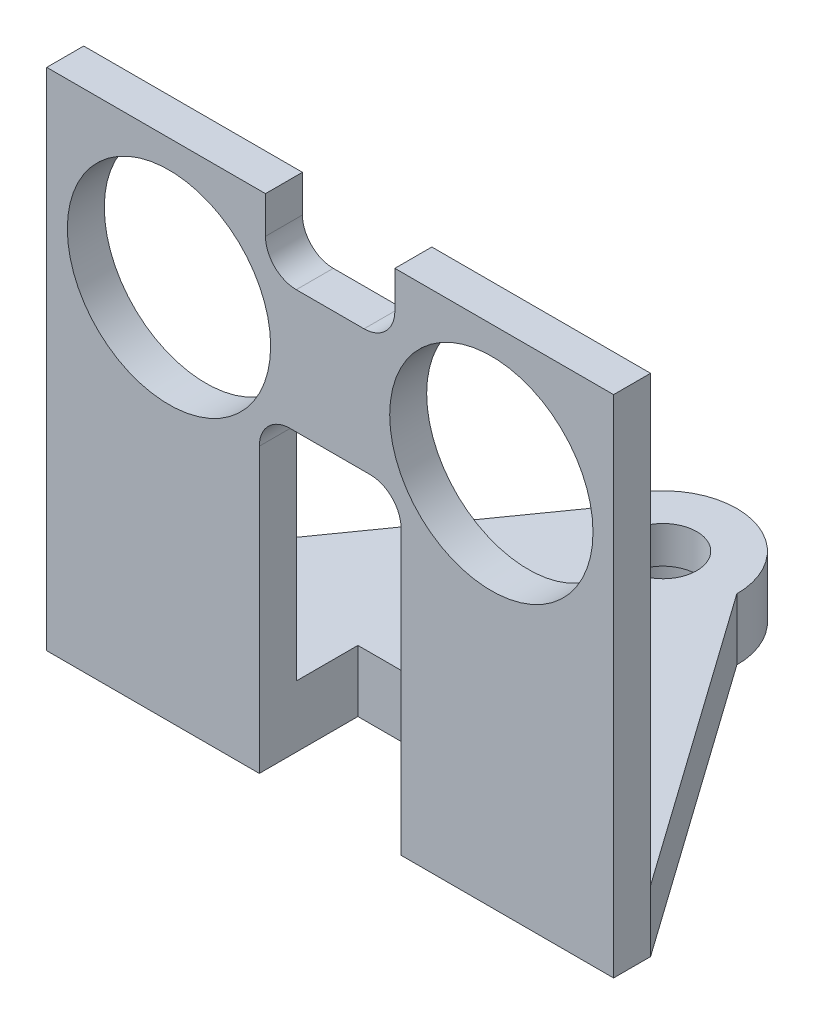
ISO-10303-21;
HEADER;
FILE_DESCRIPTION(('STEP AP214'),'2;1');
FILE_NAME('part.step','',(''),(''),'','','');
FILE_SCHEMA(('AUTOMOTIVE_DESIGN { 1 0 10303 214 1 1 1 1 }'));
ENDSEC;
DATA;
#1=APPLICATION_CONTEXT('core data for automotive mechanical design processes');
#2=APPLICATION_PROTOCOL_DEFINITION('international standard','automotive_design',2000,#1);
#3=PRODUCT_CONTEXT('',#1,'mechanical');
#4=PRODUCT('Part','Part','',(#3));
#5=PRODUCT_RELATED_PRODUCT_CATEGORY('part','',(#4));
#6=PRODUCT_DEFINITION_FORMATION('','',#4);
#7=PRODUCT_DEFINITION_CONTEXT('part definition',#1,'design');
#8=PRODUCT_DEFINITION('design','',#6,#7);
#9=PRODUCT_DEFINITION_SHAPE('','',#8);
#10=(LENGTH_UNIT() NAMED_UNIT(*) SI_UNIT(.MILLI.,.METRE.));
#11=(NAMED_UNIT(*) PLANE_ANGLE_UNIT() SI_UNIT($,.RADIAN.));
#12=(NAMED_UNIT(*) SI_UNIT($,.STERADIAN.) SOLID_ANGLE_UNIT());
#13=UNCERTAINTY_MEASURE_WITH_UNIT(LENGTH_MEASURE(1.E-05),#10,'distance_accuracy_value','');
#14=(GEOMETRIC_REPRESENTATION_CONTEXT(3) GLOBAL_UNCERTAINTY_ASSIGNED_CONTEXT((#13)) GLOBAL_UNIT_ASSIGNED_CONTEXT((#10,
#11,#12)) REPRESENTATION_CONTEXT('',''));
#15=CARTESIAN_POINT('',(0.,0.,0.));
#16=DIRECTION('',(0.,0.,1.));
#17=DIRECTION('',(1.,0.,0.));
#18=AXIS2_PLACEMENT_3D('',#15,#16,#17);
#19=CARTESIAN_POINT('',(0.,-25.5,-7.6));
#20=DIRECTION('',(0.,1.,0.));
#21=DIRECTION('',(0.,0.,1.));
#22=AXIS2_PLACEMENT_3D('',#19,#20,#21);
#23=CYLINDRICAL_SURFACE('',#22,2.1);
#24=DIRECTION('',(0.,1.,0.));
#25=VECTOR('',#24,1.);
#26=CARTESIAN_POINT('',(-2.1,-25.5,-7.6));
#27=LINE('',#26,#25);
#28=CARTESIAN_POINT('',(-2.1,-25.5,-7.6));
#29=VERTEX_POINT('',#28);
#30=CARTESIAN_POINT('',(-2.1,-23.5,-7.6));
#31=VERTEX_POINT('',#30);
#32=EDGE_CURVE('E332',#29,#31,#27,.T.);
#33=ORIENTED_EDGE('',*,*,#32,.T.);
#34=CARTESIAN_POINT('',(0.,-23.5,-7.6));
#35=DIRECTION('',(0.,1.,0.));
#36=DIRECTION('',(0.,0.,1.));
#37=AXIS2_PLACEMENT_3D('',#34,#35,#36);
#38=CIRCLE('',#37,2.1);
#39=CARTESIAN_POINT('',(2.1,-23.5,-7.6));
#40=VERTEX_POINT('',#39);
#41=EDGE_CURVE('E54',#31,#40,#38,.T.);
#42=ORIENTED_EDGE('',*,*,#41,.T.);
#43=DIRECTION('',(0.,1.,0.));
#44=VECTOR('',#43,1.);
#45=CARTESIAN_POINT('',(2.1,-25.5,-7.6));
#46=LINE('',#45,#44);
#47=CARTESIAN_POINT('',(2.1,-25.5,-7.6));
#48=VERTEX_POINT('',#47);
#49=EDGE_CURVE('E357',#48,#40,#46,.T.);
#50=ORIENTED_EDGE('',*,*,#49,.F.);
#51=CARTESIAN_POINT('',(0.,-25.5,-7.6));
#52=DIRECTION('',(0.,-1.,0.));
#53=DIRECTION('',(0.,0.,-1.));
#54=AXIS2_PLACEMENT_3D('',#51,#52,#53);
#55=CIRCLE('',#54,2.1);
#56=EDGE_CURVE('E352',#48,#29,#55,.T.);
#57=ORIENTED_EDGE('',*,*,#56,.T.);
#58=EDGE_LOOP('',(#33,#42,#50,#57));
#59=FACE_BOUND('',#58,.T.);
#60=ADVANCED_FACE('F39',(#59),#23,.F.);
#61=CARTESIAN_POINT('',(1.44072050789901,-25.5,0.122988336040159));
#62=DIRECTION('',(0.996376129781137,0.,0.0850564988837555));
#63=DIRECTION('',(0.0850564988837555,0.,-0.996376129781137));
#64=AXIS2_PLACEMENT_3D('',#61,#62,#63);
#65=PLANE('',#64);
#66=DIRECTION('',(0.0850564988837556,0.,-0.996376129781137));
#67=VECTOR('',#66,1.);
#68=CARTESIAN_POINT('',(2.1,-23.5,-7.6));
#69=LINE('',#68,#67);
#70=CARTESIAN_POINT('',(3.44935774398346,-23.5,-23.4067621438063));
#71=VERTEX_POINT('',#70);
#72=EDGE_CURVE('E836',#40,#71,#69,.T.);
#73=ORIENTED_EDGE('',*,*,#72,.T.);
#74=DIRECTION('',(0.,1.,0.));
#75=VECTOR('',#74,1.);
#76=CARTESIAN_POINT('',(3.44935774398346,-25.5,-23.4067621438063));
#77=LINE('',#76,#75);
#78=CARTESIAN_POINT('',(3.44935774398346,-25.5,-23.4067621438063));
#79=VERTEX_POINT('',#78);
#80=EDGE_CURVE('E375',#79,#71,#77,.T.);
#81=ORIENTED_EDGE('',*,*,#80,.F.);
#82=DIRECTION('',(0.0850564988837555,0.,-0.996376129781137));
#83=VECTOR('',#82,1.);
#84=CARTESIAN_POINT('',(1.44072050789901,-25.5,0.122988336040159));
#85=LINE('',#84,#83);
#86=EDGE_CURVE('E767',#48,#79,#85,.T.);
#87=ORIENTED_EDGE('',*,*,#86,.F.);
#88=ORIENTED_EDGE('',*,*,#49,.T.);
#89=EDGE_LOOP('',(#73,#81,#87,#88));
#90=FACE_BOUND('',#89,.T.);
#91=ADVANCED_FACE('F396',(#90),#65,.F.);
#92=CARTESIAN_POINT('',(0.,-25.5,-24.));
#93=DIRECTION('',(0.,1.,0.));
#94=DIRECTION('',(0.,0.,1.));
#95=AXIS2_PLACEMENT_3D('',#92,#93,#94);
#96=CYLINDRICAL_SURFACE('',#95,3.5);
#97=ORIENTED_EDGE('',*,*,#80,.T.);
#98=CARTESIAN_POINT('',(0.,-23.5,-24.));
#99=DIRECTION('',(0.,1.,0.));
#100=DIRECTION('',(0.,0.,1.));
#101=AXIS2_PLACEMENT_3D('',#98,#99,#100);
#102=CIRCLE('',#101,3.5);
#103=CARTESIAN_POINT('',(-3.44935774398346,-23.5,-23.4067621438063));
#104=VERTEX_POINT('',#103);
#105=EDGE_CURVE('E761',#71,#104,#102,.T.);
#106=ORIENTED_EDGE('',*,*,#105,.T.);
#107=DIRECTION('',(0.,1.,0.));
#108=VECTOR('',#107,1.);
#109=CARTESIAN_POINT('',(-3.44935774398346,-25.5,-23.4067621438063));
#110=LINE('',#109,#108);
#111=CARTESIAN_POINT('',(-3.44935774398346,-25.5,-23.4067621438063));
#112=VERTEX_POINT('',#111);
#113=EDGE_CURVE('E372',#112,#104,#110,.T.);
#114=ORIENTED_EDGE('',*,*,#113,.F.);
#115=CARTESIAN_POINT('',(0.,-25.5,-24.));
#116=DIRECTION('',(0.,-1.,0.));
#117=DIRECTION('',(0.,0.,-1.));
#118=AXIS2_PLACEMENT_3D('',#115,#116,#117);
#119=CIRCLE('',#118,3.5);
#120=EDGE_CURVE('E759',#112,#79,#119,.T.);
#121=ORIENTED_EDGE('',*,*,#120,.T.);
#122=EDGE_LOOP('',(#97,#106,#114,#121));
#123=FACE_BOUND('',#122,.T.);
#124=ADVANCED_FACE('F402',(#123),#96,.F.);
#125=CARTESIAN_POINT('',(-1.44072050789901,-25.5,0.122988336040159));
#126=DIRECTION('',(0.996376129781137,0.,-0.0850564988837556));
#127=DIRECTION('',(-0.0850564988837556,0.,-0.996376129781137));
#128=AXIS2_PLACEMENT_3D('',#125,#126,#127);
#129=PLANE('',#128);
#130=ORIENTED_EDGE('',*,*,#113,.T.);
#131=DIRECTION('',(0.0850564988837557,0.,0.996376129781137));
#132=VECTOR('',#131,1.);
#133=CARTESIAN_POINT('',(-2.1,-23.5,-7.6));
#134=LINE('',#133,#132);
#135=EDGE_CURVE('E337',#104,#31,#134,.T.);
#136=ORIENTED_EDGE('',*,*,#135,.T.);
#137=ORIENTED_EDGE('',*,*,#32,.F.);
#138=DIRECTION('',(-0.0850564988837557,0.,-0.996376129781137));
#139=VECTOR('',#138,1.);
#140=CARTESIAN_POINT('',(-1.44072050789901,-25.5,0.122988336040159));
#141=LINE('',#140,#139);
#142=EDGE_CURVE('E751',#29,#112,#141,.T.);
#143=ORIENTED_EDGE('',*,*,#142,.T.);
#144=EDGE_LOOP('',(#130,#136,#137,#143));
#145=FACE_BOUND('',#144,.T.);
#146=ADVANCED_FACE('F394',(#145),#129,.T.);
#147=CARTESIAN_POINT('',(0.,10.,3.));
#148=DIRECTION('',(0.,-1.,0.));
#149=DIRECTION('',(0.,0.,-1.));
#150=AXIS2_PLACEMENT_3D('',#147,#148,#149);
#151=PLANE('',#150);
#152=DIRECTION('',(-1.,0.,0.));
#153=VECTOR('',#152,1.);
#154=CARTESIAN_POINT('',(0.,10.,0.));
#155=LINE('',#154,#153);
#156=CARTESIAN_POINT('',(2.74999999999998,10.,0.));
#157=VERTEX_POINT('',#156);
#158=CARTESIAN_POINT('',(-2.74999999999998,10.,0.));
#159=VERTEX_POINT('',#158);
#160=EDGE_CURVE('E186',#157,#159,#155,.T.);
#161=ORIENTED_EDGE('',*,*,#160,.T.);
#162=DIRECTION('',(0.,0.,-1.));
#163=VECTOR('',#162,1.);
#164=CARTESIAN_POINT('',(-2.74999999999998,10.,3.));
#165=LINE('',#164,#163);
#166=CARTESIAN_POINT('',(-2.74999999999998,10.,3.));
#167=VERTEX_POINT('',#166);
#168=EDGE_CURVE('E11',#167,#159,#165,.T.);
#169=ORIENTED_EDGE('',*,*,#168,.F.);
#170=DIRECTION('',(-1.,0.,0.));
#171=VECTOR('',#170,1.);
#172=CARTESIAN_POINT('',(0.,10.,3.));
#173=LINE('',#172,#171);
#174=CARTESIAN_POINT('',(2.74999999999998,10.,3.));
#175=VERTEX_POINT('',#174);
#176=EDGE_CURVE('E382',#175,#167,#173,.T.);
#177=ORIENTED_EDGE('',*,*,#176,.F.);
#178=DIRECTION('',(0.,0.,-1.));
#179=VECTOR('',#178,1.);
#180=CARTESIAN_POINT('',(2.74999999999998,10.,3.));
#181=LINE('',#180,#179);
#182=EDGE_CURVE('E63',#175,#157,#181,.T.);
#183=ORIENTED_EDGE('',*,*,#182,.T.);
#184=EDGE_LOOP('',(#161,#169,#177,#183));
#185=FACE_BOUND('',#184,.T.);
#186=ADVANCED_FACE('F385',(#185),#151,.F.);
#187=CARTESIAN_POINT('',(-2.75,12.5,3.));
#188=DIRECTION('',(0.,0.,-1.));
#189=DIRECTION('',(-1.,0.,0.));
#190=AXIS2_PLACEMENT_3D('',#187,#188,#189);
#191=CYLINDRICAL_SURFACE('',#190,2.5);
#192=CARTESIAN_POINT('',(-2.75,12.5,0.));
#193=DIRECTION('',(0.,0.,1.));
#194=DIRECTION('',(1.,0.,0.));
#195=AXIS2_PLACEMENT_3D('',#192,#193,#194);
#196=CIRCLE('',#195,2.5);
#197=CARTESIAN_POINT('',(-5.25,12.5,0.));
#198=VERTEX_POINT('',#197);
#199=EDGE_CURVE('E189',#159,#198,#196,.F.);
#200=ORIENTED_EDGE('',*,*,#199,.T.);
#201=DIRECTION('',(0.,0.,-1.));
#202=VECTOR('',#201,1.);
#203=CARTESIAN_POINT('',(-5.25,12.5,3.));
#204=LINE('',#203,#202);
#205=CARTESIAN_POINT('',(-5.25,12.5,3.));
#206=VERTEX_POINT('',#205);
#207=EDGE_CURVE('E47',#206,#198,#204,.T.);
#208=ORIENTED_EDGE('',*,*,#207,.F.);
#209=CARTESIAN_POINT('',(-2.75,12.5,3.));
#210=DIRECTION('',(0.,0.,1.));
#211=DIRECTION('',(1.,0.,0.));
#212=AXIS2_PLACEMENT_3D('',#209,#210,#211);
#213=CIRCLE('',#212,2.5);
#214=EDGE_CURVE('E120',#167,#206,#213,.F.);
#215=ORIENTED_EDGE('',*,*,#214,.F.);
#216=ORIENTED_EDGE('',*,*,#168,.T.);
#217=EDGE_LOOP('',(#200,#208,#215,#216));
#218=FACE_BOUND('',#217,.T.);
#219=ADVANCED_FACE('F386',(#218),#191,.F.);
#220=CARTESIAN_POINT('',(-5.25,0.,3.));
#221=DIRECTION('',(-1.,0.,0.));
#222=DIRECTION('',(0.,0.,1.));
#223=AXIS2_PLACEMENT_3D('',#220,#221,#222);
#224=PLANE('',#223);
#225=DIRECTION('',(0.,1.,0.));
#226=VECTOR('',#225,1.);
#227=CARTESIAN_POINT('',(-5.25,0.,0.));
#228=LINE('',#227,#226);
#229=CARTESIAN_POINT('',(-5.25,15.5,0.));
#230=VERTEX_POINT('',#229);
#231=EDGE_CURVE('E191',#198,#230,#228,.T.);
#232=ORIENTED_EDGE('',*,*,#231,.T.);
#233=DIRECTION('',(0.,0.,-1.));
#234=VECTOR('',#233,1.);
#235=CARTESIAN_POINT('',(-5.25,15.5,3.));
#236=LINE('',#235,#234);
#237=CARTESIAN_POINT('',(-5.25,15.5,3.));
#238=VERTEX_POINT('',#237);
#239=EDGE_CURVE('E245',#238,#230,#236,.T.);
#240=ORIENTED_EDGE('',*,*,#239,.F.);
#241=DIRECTION('',(0.,1.,0.));
#242=VECTOR('',#241,1.);
#243=CARTESIAN_POINT('',(-5.25,0.,3.));
#244=LINE('',#243,#242);
#245=EDGE_CURVE('E253',#206,#238,#244,.T.);
#246=ORIENTED_EDGE('',*,*,#245,.F.);
#247=ORIENTED_EDGE('',*,*,#207,.T.);
#248=EDGE_LOOP('',(#232,#240,#246,#247));
#249=FACE_BOUND('',#248,.T.);
#250=ADVANCED_FACE('F251',(#249),#224,.F.);
#251=CARTESIAN_POINT('',(0.,15.5,3.));
#252=DIRECTION('',(0.,-1.,0.));
#253=DIRECTION('',(1.,0.,0.));
#254=AXIS2_PLACEMENT_3D('',#251,#252,#253);
#255=PLANE('',#254);
#256=DIRECTION('',(-1.,0.,0.));
#257=VECTOR('',#256,1.);
#258=CARTESIAN_POINT('',(0.,15.5,0.));
#259=LINE('',#258,#257);
#260=CARTESIAN_POINT('',(-23.,15.5,0.));
#261=VERTEX_POINT('',#260);
#262=EDGE_CURVE('E193',#230,#261,#259,.T.);
#263=ORIENTED_EDGE('',*,*,#262,.T.);
#264=DIRECTION('',(0.,0.,-1.));
#265=VECTOR('',#264,1.);
#266=CARTESIAN_POINT('',(-23.,15.5,3.));
#267=LINE('',#266,#265);
#268=CARTESIAN_POINT('',(-23.,15.5,3.));
#269=VERTEX_POINT('',#268);
#270=EDGE_CURVE('E242',#269,#261,#267,.T.);
#271=ORIENTED_EDGE('',*,*,#270,.F.);
#272=DIRECTION('',(-1.,0.,0.));
#273=VECTOR('',#272,1.);
#274=CARTESIAN_POINT('',(0.,15.5,3.));
#275=LINE('',#274,#273);
#276=EDGE_CURVE('E277',#238,#269,#275,.T.);
#277=ORIENTED_EDGE('',*,*,#276,.F.);
#278=ORIENTED_EDGE('',*,*,#239,.T.);
#279=EDGE_LOOP('',(#263,#271,#277,#278));
#280=FACE_BOUND('',#279,.T.);
#281=ADVANCED_FACE('F262',(#280),#255,.F.);
#282=CARTESIAN_POINT('',(-23.,0.,3.));
#283=DIRECTION('',(1.,0.,0.));
#284=DIRECTION('',(0.,0.,-1.));
#285=AXIS2_PLACEMENT_3D('',#282,#283,#284);
#286=PLANE('',#285);
#287=DIRECTION('',(0.,-1.,0.));
#288=VECTOR('',#287,1.);
#289=CARTESIAN_POINT('',(-23.,0.,0.));
#290=LINE('',#289,#288);
#291=CARTESIAN_POINT('',(-23.,-20.5,0.));
#292=VERTEX_POINT('',#291);
#293=EDGE_CURVE('E195',#261,#292,#290,.T.);
#294=ORIENTED_EDGE('',*,*,#293,.T.);
#295=DIRECTION('',(0.,1.,0.));
#296=VECTOR('',#295,1.);
#297=CARTESIAN_POINT('',(-23.,-25.5,0.));
#298=LINE('',#297,#296);
#299=CARTESIAN_POINT('',(-23.,-25.5,0.));
#300=VERTEX_POINT('',#299);
#301=EDGE_CURVE('E353',#300,#292,#298,.T.);
#302=ORIENTED_EDGE('',*,*,#301,.F.);
#303=DIRECTION('',(0.,0.,1.));
#304=VECTOR('',#303,1.);
#305=CARTESIAN_POINT('',(-23.,-25.5,0.));
#306=LINE('',#305,#304);
#307=CARTESIAN_POINT('',(-23.,-25.5,3.));
#308=VERTEX_POINT('',#307);
#309=EDGE_CURVE('E273',#300,#308,#306,.T.);
#310=ORIENTED_EDGE('',*,*,#309,.T.);
#311=DIRECTION('',(0.,-1.,0.));
#312=VECTOR('',#311,1.);
#313=CARTESIAN_POINT('',(-23.,0.,3.));
#314=LINE('',#313,#312);
#315=EDGE_CURVE('E270',#269,#308,#314,.T.);
#316=ORIENTED_EDGE('',*,*,#315,.F.);
#317=ORIENTED_EDGE('',*,*,#270,.T.);
#318=EDGE_LOOP('',(#294,#302,#310,#316,#317));
#319=FACE_BOUND('',#318,.T.);
#320=ADVANCED_FACE('F266',(#319),#286,.F.);
#321=CARTESIAN_POINT('',(-5.74999999999999,0.,3.));
#322=DIRECTION('',(-1.,0.,0.));
#323=DIRECTION('',(0.,-1.,0.));
#324=AXIS2_PLACEMENT_3D('',#321,#322,#323);
#325=PLANE('',#324);
#326=DIRECTION('',(0.,1.,0.));
#327=VECTOR('',#326,1.);
#328=CARTESIAN_POINT('',(-5.74999999999999,0.,0.));
#329=LINE('',#328,#327);
#330=CARTESIAN_POINT('',(-5.74999999999999,-20.5,0.));
#331=VERTEX_POINT('',#330);
#332=CARTESIAN_POINT('',(-5.74999999999999,-2.50000000000002,0.));
#333=VERTEX_POINT('',#332);
#334=EDGE_CURVE('E200',#331,#333,#329,.T.);
#335=ORIENTED_EDGE('',*,*,#334,.T.);
#336=DIRECTION('',(0.,0.,-1.));
#337=VECTOR('',#336,1.);
#338=CARTESIAN_POINT('',(-5.74999999999999,-2.50000000000002,3.));
#339=LINE('',#338,#337);
#340=CARTESIAN_POINT('',(-5.74999999999999,-2.50000000000002,3.));
#341=VERTEX_POINT('',#340);
#342=EDGE_CURVE('E239',#341,#333,#339,.T.);
#343=ORIENTED_EDGE('',*,*,#342,.F.);
#344=DIRECTION('',(0.,1.,0.));
#345=VECTOR('',#344,1.);
#346=CARTESIAN_POINT('',(-5.74999999999999,0.,3.));
#347=LINE('',#346,#345);
#348=CARTESIAN_POINT('',(-5.74999999999999,-25.5,3.));
#349=VERTEX_POINT('',#348);
#350=EDGE_CURVE('E276',#349,#341,#347,.T.);
#351=ORIENTED_EDGE('',*,*,#350,.F.);
#352=DIRECTION('',(0.,0.,-1.));
#353=VECTOR('',#352,1.);
#354=CARTESIAN_POINT('',(-5.74999999999999,-25.5,0.));
#355=LINE('',#354,#353);
#356=CARTESIAN_POINT('',(-5.74999999999999,-25.5,-5.));
#357=VERTEX_POINT('',#356);
#358=EDGE_CURVE('E326',#349,#357,#355,.T.);
#359=ORIENTED_EDGE('',*,*,#358,.T.);
#360=DIRECTION('',(0.,1.,0.));
#361=VECTOR('',#360,1.);
#362=CARTESIAN_POINT('',(-5.74999999999999,-25.5,-5.));
#363=LINE('',#362,#361);
#364=CARTESIAN_POINT('',(-5.74999999999999,-20.5,-5.));
#365=VERTEX_POINT('',#364);
#366=EDGE_CURVE('E356',#357,#365,#363,.T.);
#367=ORIENTED_EDGE('',*,*,#366,.T.);
#368=DIRECTION('',(0.,0.,-1.));
#369=VECTOR('',#368,1.);
#370=CARTESIAN_POINT('',(-5.74999999999999,-20.5,0.));
#371=LINE('',#370,#369);
#372=EDGE_CURVE('E349',#331,#365,#371,.T.);
#373=ORIENTED_EDGE('',*,*,#372,.F.);
#374=EDGE_LOOP('',(#335,#343,#351,#359,#367,#373));
#375=FACE_BOUND('',#374,.T.);
#376=ADVANCED_FACE('F442',(#375),#325,.F.);
#377=CARTESIAN_POINT('',(-3.24999999999999,-2.5,3.));
#378=DIRECTION('',(0.,0.,-1.));
#379=DIRECTION('',(-1.,0.,0.));
#380=AXIS2_PLACEMENT_3D('',#377,#378,#379);
#381=CYLINDRICAL_SURFACE('',#380,2.5);
#382=CARTESIAN_POINT('',(-3.24999999999999,-2.5,0.));
#383=DIRECTION('',(0.,0.,1.));
#384=DIRECTION('',(1.,0.,0.));
#385=AXIS2_PLACEMENT_3D('',#382,#383,#384);
#386=CIRCLE('',#385,2.5);
#387=CARTESIAN_POINT('',(-3.24999999999998,0.,0.));
#388=VERTEX_POINT('',#387);
#389=EDGE_CURVE('E202',#333,#388,#386,.F.);
#390=ORIENTED_EDGE('',*,*,#389,.T.);
#391=DIRECTION('',(0.,0.,-1.));
#392=VECTOR('',#391,1.);
#393=CARTESIAN_POINT('',(-3.24999999999998,0.,3.));
#394=LINE('',#393,#392);
#395=CARTESIAN_POINT('',(-3.24999999999998,0.,3.));
#396=VERTEX_POINT('',#395);
#397=EDGE_CURVE('E236',#396,#388,#394,.T.);
#398=ORIENTED_EDGE('',*,*,#397,.F.);
#399=CARTESIAN_POINT('',(-3.24999999999999,-2.5,3.));
#400=DIRECTION('',(0.,0.,1.));
#401=DIRECTION('',(1.,0.,0.));
#402=AXIS2_PLACEMENT_3D('',#399,#400,#401);
#403=CIRCLE('',#402,2.5);
#404=EDGE_CURVE('E279',#341,#396,#403,.F.);
#405=ORIENTED_EDGE('',*,*,#404,.F.);
#406=ORIENTED_EDGE('',*,*,#342,.T.);
#407=EDGE_LOOP('',(#390,#398,#405,#406));
#408=FACE_BOUND('',#407,.T.);
#409=ADVANCED_FACE('F438',(#408),#381,.F.);
#410=CARTESIAN_POINT('',(0.,0.,3.));
#411=DIRECTION('',(0.,1.,0.));
#412=DIRECTION('',(0.,0.,1.));
#413=AXIS2_PLACEMENT_3D('',#410,#411,#412);
#414=PLANE('',#413);
#415=DIRECTION('',(1.,0.,0.));
#416=VECTOR('',#415,1.);
#417=CARTESIAN_POINT('',(0.,0.,0.));
#418=LINE('',#417,#416);
#419=CARTESIAN_POINT('',(3.24999999999998,0.,0.));
#420=VERTEX_POINT('',#419);
#421=EDGE_CURVE('E204',#388,#420,#418,.T.);
#422=ORIENTED_EDGE('',*,*,#421,.T.);
#423=DIRECTION('',(0.,0.,-1.));
#424=VECTOR('',#423,1.);
#425=CARTESIAN_POINT('',(3.24999999999998,0.,3.));
#426=LINE('',#425,#424);
#427=CARTESIAN_POINT('',(3.24999999999998,0.,3.));
#428=VERTEX_POINT('',#427);
#429=EDGE_CURVE('E234',#428,#420,#426,.T.);
#430=ORIENTED_EDGE('',*,*,#429,.F.);
#431=DIRECTION('',(1.,0.,0.));
#432=VECTOR('',#431,1.);
#433=CARTESIAN_POINT('',(0.,0.,3.));
#434=LINE('',#433,#432);
#435=EDGE_CURVE('E285',#396,#428,#434,.T.);
#436=ORIENTED_EDGE('',*,*,#435,.F.);
#437=ORIENTED_EDGE('',*,*,#397,.T.);
#438=EDGE_LOOP('',(#422,#430,#436,#437));
#439=FACE_BOUND('',#438,.T.);
#440=ADVANCED_FACE('F434',(#439),#414,.F.);
#441=CARTESIAN_POINT('',(3.24999999999999,-2.5,3.));
#442=DIRECTION('',(0.,0.,-1.));
#443=DIRECTION('',(-1.,0.,0.));
#444=AXIS2_PLACEMENT_3D('',#441,#442,#443);
#445=CYLINDRICAL_SURFACE('',#444,2.5);
#446=CARTESIAN_POINT('',(3.24999999999999,-2.5,0.));
#447=DIRECTION('',(0.,0.,1.));
#448=DIRECTION('',(1.,0.,0.));
#449=AXIS2_PLACEMENT_3D('',#446,#447,#448);
#450=CIRCLE('',#449,2.5);
#451=CARTESIAN_POINT('',(5.74999999999999,-2.50000000000002,0.));
#452=VERTEX_POINT('',#451);
#453=EDGE_CURVE('E207',#452,#420,#450,.T.);
#454=ORIENTED_EDGE('',*,*,#453,.F.);
#455=DIRECTION('',(0.,0.,-1.));
#456=VECTOR('',#455,1.);
#457=CARTESIAN_POINT('',(5.74999999999999,-2.50000000000002,3.));
#458=LINE('',#457,#456);
#459=CARTESIAN_POINT('',(5.74999999999999,-2.50000000000002,3.));
#460=VERTEX_POINT('',#459);
#461=EDGE_CURVE('E232',#460,#452,#458,.T.);
#462=ORIENTED_EDGE('',*,*,#461,.F.);
#463=CARTESIAN_POINT('',(3.24999999999999,-2.5,3.));
#464=DIRECTION('',(0.,0.,1.));
#465=DIRECTION('',(1.,0.,0.));
#466=AXIS2_PLACEMENT_3D('',#463,#464,#465);
#467=CIRCLE('',#466,2.5);
#468=EDGE_CURVE('E287',#460,#428,#467,.T.);
#469=ORIENTED_EDGE('',*,*,#468,.T.);
#470=ORIENTED_EDGE('',*,*,#429,.T.);
#471=EDGE_LOOP('',(#454,#462,#469,#470));
#472=FACE_BOUND('',#471,.T.);
#473=ADVANCED_FACE('F430',(#472),#445,.F.);
#474=CARTESIAN_POINT('',(5.74999999999999,0.,3.));
#475=DIRECTION('',(-1.,0.,0.));
#476=DIRECTION('',(0.,-1.,0.));
#477=AXIS2_PLACEMENT_3D('',#474,#475,#476);
#478=PLANE('',#477);
#479=DIRECTION('',(0.,1.,0.));
#480=VECTOR('',#479,1.);
#481=CARTESIAN_POINT('',(5.74999999999999,0.,0.));
#482=LINE('',#481,#480);
#483=CARTESIAN_POINT('',(5.74999999999999,-20.5,0.));
#484=VERTEX_POINT('',#483);
#485=EDGE_CURVE('E210',#484,#452,#482,.T.);
#486=ORIENTED_EDGE('',*,*,#485,.F.);
#487=DIRECTION('',(0.,0.,-1.));
#488=VECTOR('',#487,1.);
#489=CARTESIAN_POINT('',(5.74999999999999,-20.5,0.));
#490=LINE('',#489,#488);
#491=CARTESIAN_POINT('',(5.74999999999999,-20.5,-5.));
#492=VERTEX_POINT('',#491);
#493=EDGE_CURVE('E343',#484,#492,#490,.T.);
#494=ORIENTED_EDGE('',*,*,#493,.T.);
#495=DIRECTION('',(0.,1.,0.));
#496=VECTOR('',#495,1.);
#497=CARTESIAN_POINT('',(5.74999999999999,-25.5,-5.));
#498=LINE('',#497,#496);
#499=CARTESIAN_POINT('',(5.74999999999999,-25.5,-5.));
#500=VERTEX_POINT('',#499);
#501=EDGE_CURVE('E360',#500,#492,#498,.T.);
#502=ORIENTED_EDGE('',*,*,#501,.F.);
#503=DIRECTION('',(0.,0.,-1.));
#504=VECTOR('',#503,1.);
#505=CARTESIAN_POINT('',(5.74999999999999,-25.5,0.));
#506=LINE('',#505,#504);
#507=CARTESIAN_POINT('',(5.74999999999999,-25.5,3.));
#508=VERTEX_POINT('',#507);
#509=EDGE_CURVE('E318',#508,#500,#506,.T.);
#510=ORIENTED_EDGE('',*,*,#509,.F.);
#511=DIRECTION('',(0.,1.,0.));
#512=VECTOR('',#511,1.);
#513=CARTESIAN_POINT('',(5.74999999999999,0.,3.));
#514=LINE('',#513,#512);
#515=EDGE_CURVE('E290',#508,#460,#514,.T.);
#516=ORIENTED_EDGE('',*,*,#515,.T.);
#517=ORIENTED_EDGE('',*,*,#461,.T.);
#518=EDGE_LOOP('',(#486,#494,#502,#510,#516,#517));
#519=FACE_BOUND('',#518,.T.);
#520=ADVANCED_FACE('F427',(#519),#478,.T.);
#521=CARTESIAN_POINT('',(23.,0.,3.));
#522=DIRECTION('',(1.,0.,0.));
#523=DIRECTION('',(0.,0.,-1.));
#524=AXIS2_PLACEMENT_3D('',#521,#522,#523);
#525=PLANE('',#524);
#526=DIRECTION('',(0.,-1.,0.));
#527=VECTOR('',#526,1.);
#528=CARTESIAN_POINT('',(23.,0.,0.));
#529=LINE('',#528,#527);
#530=CARTESIAN_POINT('',(23.,15.5,0.));
#531=VERTEX_POINT('',#530);
#532=CARTESIAN_POINT('',(23.,-20.5,0.));
#533=VERTEX_POINT('',#532);
#534=EDGE_CURVE('E216',#531,#533,#529,.T.);
#535=ORIENTED_EDGE('',*,*,#534,.F.);
#536=DIRECTION('',(0.,0.,-1.));
#537=VECTOR('',#536,1.);
#538=CARTESIAN_POINT('',(23.,15.5,3.));
#539=LINE('',#538,#537);
#540=CARTESIAN_POINT('',(23.,15.5,3.));
#541=VERTEX_POINT('',#540);
#542=EDGE_CURVE('E160',#541,#531,#539,.T.);
#543=ORIENTED_EDGE('',*,*,#542,.F.);
#544=DIRECTION('',(0.,-1.,0.));
#545=VECTOR('',#544,1.);
#546=CARTESIAN_POINT('',(23.,0.,3.));
#547=LINE('',#546,#545);
#548=CARTESIAN_POINT('',(23.,-25.5,3.));
#549=VERTEX_POINT('',#548);
#550=EDGE_CURVE('E172',#541,#549,#547,.T.);
#551=ORIENTED_EDGE('',*,*,#550,.T.);
#552=DIRECTION('',(0.,0.,1.));
#553=VECTOR('',#552,1.);
#554=CARTESIAN_POINT('',(23.,-25.5,0.));
#555=LINE('',#554,#553);
#556=CARTESIAN_POINT('',(23.,-25.5,0.));
#557=VERTEX_POINT('',#556);
#558=EDGE_CURVE('E300',#557,#549,#555,.T.);
#559=ORIENTED_EDGE('',*,*,#558,.F.);
#560=DIRECTION('',(0.,1.,0.));
#561=VECTOR('',#560,1.);
#562=CARTESIAN_POINT('',(23.,-25.5,0.));
#563=LINE('',#562,#561);
#564=EDGE_CURVE('E363',#557,#533,#563,.T.);
#565=ORIENTED_EDGE('',*,*,#564,.T.);
#566=EDGE_LOOP('',(#535,#543,#551,#559,#565));
#567=FACE_BOUND('',#566,.T.);
#568=ADVANCED_FACE('F297',(#567),#525,.T.);
#569=CARTESIAN_POINT('',(0.,15.5,3.));
#570=DIRECTION('',(0.,1.,0.));
#571=DIRECTION('',(-1.,0.,0.));
#572=AXIS2_PLACEMENT_3D('',#569,#570,#571);
#573=PLANE('',#572);
#574=DIRECTION('',(1.,0.,0.));
#575=VECTOR('',#574,1.);
#576=CARTESIAN_POINT('',(0.,15.5,0.));
#577=LINE('',#576,#575);
#578=CARTESIAN_POINT('',(5.25,15.5,0.));
#579=VERTEX_POINT('',#578);
#580=EDGE_CURVE('E155',#579,#531,#577,.T.);
#581=ORIENTED_EDGE('',*,*,#580,.F.);
#582=DIRECTION('',(0.,0.,-1.));
#583=VECTOR('',#582,1.);
#584=CARTESIAN_POINT('',(5.25,15.5,3.));
#585=LINE('',#584,#583);
#586=CARTESIAN_POINT('',(5.25,15.5,3.));
#587=VERTEX_POINT('',#586);
#588=EDGE_CURVE('E150',#587,#579,#585,.T.);
#589=ORIENTED_EDGE('',*,*,#588,.F.);
#590=DIRECTION('',(1.,0.,0.));
#591=VECTOR('',#590,1.);
#592=CARTESIAN_POINT('',(0.,15.5,3.));
#593=LINE('',#592,#591);
#594=EDGE_CURVE('E153',#587,#541,#593,.T.);
#595=ORIENTED_EDGE('',*,*,#594,.T.);
#596=ORIENTED_EDGE('',*,*,#542,.T.);
#597=EDGE_LOOP('',(#581,#589,#595,#596));
#598=FACE_BOUND('',#597,.T.);
#599=ADVANCED_FACE('F152',(#598),#573,.T.);
#600=CARTESIAN_POINT('',(5.25,0.,3.));
#601=DIRECTION('',(-1.,0.,0.));
#602=DIRECTION('',(0.,0.,1.));
#603=AXIS2_PLACEMENT_3D('',#600,#601,#602);
#604=PLANE('',#603);
#605=DIRECTION('',(0.,1.,0.));
#606=VECTOR('',#605,1.);
#607=CARTESIAN_POINT('',(5.25,0.,0.));
#608=LINE('',#607,#606);
#609=CARTESIAN_POINT('',(5.25,12.5,0.));
#610=VERTEX_POINT('',#609);
#611=EDGE_CURVE('E220',#610,#579,#608,.T.);
#612=ORIENTED_EDGE('',*,*,#611,.F.);
#613=DIRECTION('',(0.,0.,-1.));
#614=VECTOR('',#613,1.);
#615=CARTESIAN_POINT('',(5.25,12.5,3.));
#616=LINE('',#615,#614);
#617=CARTESIAN_POINT('',(5.25,12.5,3.));
#618=VERTEX_POINT('',#617);
#619=EDGE_CURVE('E161',#618,#610,#616,.T.);
#620=ORIENTED_EDGE('',*,*,#619,.F.);
#621=DIRECTION('',(0.,1.,0.));
#622=VECTOR('',#621,1.);
#623=CARTESIAN_POINT('',(5.25,0.,3.));
#624=LINE('',#623,#622);
#625=EDGE_CURVE('E169',#618,#587,#624,.T.);
#626=ORIENTED_EDGE('',*,*,#625,.T.);
#627=ORIENTED_EDGE('',*,*,#588,.T.);
#628=EDGE_LOOP('',(#612,#620,#626,#627));
#629=FACE_BOUND('',#628,.T.);
#630=ADVANCED_FACE('F174',(#629),#604,.T.);
#631=CARTESIAN_POINT('',(2.75,12.5,3.));
#632=DIRECTION('',(0.,0.,-1.));
#633=DIRECTION('',(-1.,0.,0.));
#634=AXIS2_PLACEMENT_3D('',#631,#632,#633);
#635=CYLINDRICAL_SURFACE('',#634,2.5);
#636=CARTESIAN_POINT('',(2.75,12.5,0.));
#637=DIRECTION('',(0.,0.,1.));
#638=DIRECTION('',(1.,0.,0.));
#639=AXIS2_PLACEMENT_3D('',#636,#637,#638);
#640=CIRCLE('',#639,2.5);
#641=EDGE_CURVE('E222',#157,#610,#640,.T.);
#642=ORIENTED_EDGE('',*,*,#641,.F.);
#643=ORIENTED_EDGE('',*,*,#182,.F.);
#644=CARTESIAN_POINT('',(2.75,12.5,3.));
#645=DIRECTION('',(0.,0.,1.));
#646=DIRECTION('',(1.,0.,0.));
#647=AXIS2_PLACEMENT_3D('',#644,#645,#646);
#648=CIRCLE('',#647,2.5);
#649=EDGE_CURVE('E175',#175,#618,#648,.T.);
#650=ORIENTED_EDGE('',*,*,#649,.T.);
#651=ORIENTED_EDGE('',*,*,#619,.T.);
#652=EDGE_LOOP('',(#642,#643,#650,#651));
#653=FACE_BOUND('',#652,.T.);
#654=ADVANCED_FACE('F418',(#653),#635,.F.);
#655=CARTESIAN_POINT('',(-13.08,5.,3.));
#656=DIRECTION('',(0.,0.,-1.));
#657=DIRECTION('',(-1.,0.,0.));
#658=AXIS2_PLACEMENT_3D('',#655,#656,#657);
#659=CYLINDRICAL_SURFACE('',#658,8.25);
#660=CARTESIAN_POINT('',(-13.08,5.,3.));
#661=DIRECTION('',(0.,0.,1.));
#662=DIRECTION('',(1.,0.,0.));
#663=AXIS2_PLACEMENT_3D('',#660,#661,#662);
#664=CIRCLE('',#663,8.25);
#665=CARTESIAN_POINT('',(-4.83,5.,3.));
#666=VERTEX_POINT('',#665);
#667=EDGE_CURVE('E228',#666,#666,#664,.T.);
#668=ORIENTED_EDGE('',*,*,#667,.T.);
#669=EDGE_LOOP('',(#668));
#670=FACE_BOUND('',#669,.T.);
#671=CARTESIAN_POINT('',(-13.08,5.,0.));
#672=DIRECTION('',(0.,0.,1.));
#673=DIRECTION('',(1.,0.,0.));
#674=AXIS2_PLACEMENT_3D('',#671,#672,#673);
#675=CIRCLE('',#674,8.25);
#676=CARTESIAN_POINT('',(-4.83,5.,0.));
#677=VERTEX_POINT('',#676);
#678=EDGE_CURVE('E183',#677,#677,#675,.T.);
#679=ORIENTED_EDGE('',*,*,#678,.F.);
#680=EDGE_LOOP('',(#679));
#681=FACE_BOUND('',#680,.T.);
#682=ADVANCED_FACE('F41',(#670,#681),#659,.F.);
#683=CARTESIAN_POINT('',(13.08,5.,3.));
#684=DIRECTION('',(0.,0.,-1.));
#685=DIRECTION('',(-1.,0.,0.));
#686=AXIS2_PLACEMENT_3D('',#683,#684,#685);
#687=CYLINDRICAL_SURFACE('',#686,8.25);
#688=CARTESIAN_POINT('',(13.08,5.,3.));
#689=DIRECTION('',(0.,0.,1.));
#690=DIRECTION('',(1.,0.,0.));
#691=AXIS2_PLACEMENT_3D('',#688,#689,#690);
#692=CIRCLE('',#691,8.25);
#693=CARTESIAN_POINT('',(21.33,5.,3.));
#694=VERTEX_POINT('',#693);
#695=EDGE_CURVE('E177',#694,#694,#692,.F.);
#696=ORIENTED_EDGE('',*,*,#695,.F.);
#697=EDGE_LOOP('',(#696));
#698=FACE_BOUND('',#697,.T.);
#699=CARTESIAN_POINT('',(13.08,5.,0.));
#700=DIRECTION('',(0.,0.,1.));
#701=DIRECTION('',(1.,0.,0.));
#702=AXIS2_PLACEMENT_3D('',#699,#700,#701);
#703=CIRCLE('',#702,8.25);
#704=CARTESIAN_POINT('',(21.33,5.,0.));
#705=VERTEX_POINT('',#704);
#706=EDGE_CURVE('E225',#705,#705,#703,.F.);
#707=ORIENTED_EDGE('',*,*,#706,.T.);
#708=EDGE_LOOP('',(#707));
#709=FACE_BOUND('',#708,.T.);
#710=ADVANCED_FACE('F409',(#698,#709),#687,.F.);
#711=CARTESIAN_POINT('',(0.,0.,3.));
#712=DIRECTION('',(0.,0.,1.));
#713=DIRECTION('',(1.,0.,0.));
#714=AXIS2_PLACEMENT_3D('',#711,#712,#713);
#715=PLANE('',#714);
#716=ORIENTED_EDGE('',*,*,#667,.F.);
#717=EDGE_LOOP('',(#716));
#718=FACE_BOUND('',#717,.T.);
#719=ORIENTED_EDGE('',*,*,#176,.T.);
#720=ORIENTED_EDGE('',*,*,#214,.T.);
#721=ORIENTED_EDGE('',*,*,#245,.T.);
#722=ORIENTED_EDGE('',*,*,#276,.T.);
#723=ORIENTED_EDGE('',*,*,#315,.T.);
#724=DIRECTION('',(1.,0.,0.));
#725=VECTOR('',#724,1.);
#726=CARTESIAN_POINT('',(0.,-25.5,3.));
#727=LINE('',#726,#725);
#728=EDGE_CURVE('E329',#308,#349,#727,.T.);
#729=ORIENTED_EDGE('',*,*,#728,.T.);
#730=ORIENTED_EDGE('',*,*,#350,.T.);
#731=ORIENTED_EDGE('',*,*,#404,.T.);
#732=ORIENTED_EDGE('',*,*,#435,.T.);
#733=ORIENTED_EDGE('',*,*,#468,.F.);
#734=ORIENTED_EDGE('',*,*,#515,.F.);
#735=DIRECTION('',(-1.,0.,0.));
#736=VECTOR('',#735,1.);
#737=CARTESIAN_POINT('',(0.,-25.5,3.));
#738=LINE('',#737,#736);
#739=EDGE_CURVE('E309',#549,#508,#738,.T.);
#740=ORIENTED_EDGE('',*,*,#739,.F.);
#741=ORIENTED_EDGE('',*,*,#550,.F.);
#742=ORIENTED_EDGE('',*,*,#594,.F.);
#743=ORIENTED_EDGE('',*,*,#625,.F.);
#744=ORIENTED_EDGE('',*,*,#649,.F.);
#745=EDGE_LOOP('',(#719,#720,#721,#722,#723,#729,#730,#731,#732,#733,#734,#740,#741,#742,#743,#744));
#746=FACE_BOUND('',#745,.T.);
#747=ORIENTED_EDGE('',*,*,#695,.T.);
#748=EDGE_LOOP('',(#747));
#749=FACE_BOUND('',#748,.T.);
#750=ADVANCED_FACE('F166',(#718,#746,#749),#715,.T.);
#751=CARTESIAN_POINT('',(0.,0.,0.));
#752=DIRECTION('',(0.,0.,1.));
#753=DIRECTION('',(1.,0.,0.));
#754=AXIS2_PLACEMENT_3D('',#751,#752,#753);
#755=PLANE('',#754);
#756=ORIENTED_EDGE('',*,*,#678,.T.);
#757=EDGE_LOOP('',(#756));
#758=FACE_BOUND('',#757,.T.);
#759=ORIENTED_EDGE('',*,*,#160,.F.);
#760=ORIENTED_EDGE('',*,*,#641,.T.);
#761=ORIENTED_EDGE('',*,*,#611,.T.);
#762=ORIENTED_EDGE('',*,*,#580,.T.);
#763=ORIENTED_EDGE('',*,*,#534,.T.);
#764=DIRECTION('',(-1.,0.,0.));
#765=VECTOR('',#764,1.);
#766=CARTESIAN_POINT('',(0.,-20.5,0.));
#767=LINE('',#766,#765);
#768=EDGE_CURVE('E213',#533,#484,#767,.T.);
#769=ORIENTED_EDGE('',*,*,#768,.T.);
#770=ORIENTED_EDGE('',*,*,#485,.T.);
#771=ORIENTED_EDGE('',*,*,#453,.T.);
#772=ORIENTED_EDGE('',*,*,#421,.F.);
#773=ORIENTED_EDGE('',*,*,#389,.F.);
#774=ORIENTED_EDGE('',*,*,#334,.F.);
#775=DIRECTION('',(1.,0.,0.));
#776=VECTOR('',#775,1.);
#777=CARTESIAN_POINT('',(0.,-20.5,0.));
#778=LINE('',#777,#776);
#779=EDGE_CURVE('E197',#292,#331,#778,.T.);
#780=ORIENTED_EDGE('',*,*,#779,.F.);
#781=ORIENTED_EDGE('',*,*,#293,.F.);
#782=ORIENTED_EDGE('',*,*,#262,.F.);
#783=ORIENTED_EDGE('',*,*,#231,.F.);
#784=ORIENTED_EDGE('',*,*,#199,.F.);
#785=EDGE_LOOP('',(#759,#760,#761,#762,#763,#769,#770,#771,#772,#773,#774,#780,#781,#782,#783,#784));
#786=FACE_BOUND('',#785,.T.);
#787=ORIENTED_EDGE('',*,*,#706,.F.);
#788=EDGE_LOOP('',(#787));
#789=FACE_BOUND('',#788,.T.);
#790=ADVANCED_FACE('F256',(#758,#786,#789),#755,.F.);
#791=CARTESIAN_POINT('',(0.,-20.5,0.));
#792=DIRECTION('',(0.,-1.,0.));
#793=DIRECTION('',(0.,0.,-1.));
#794=AXIS2_PLACEMENT_3D('',#791,#792,#793);
#795=PLANE('',#794);
#796=CARTESIAN_POINT('',(0.,-20.5,-24.));
#797=DIRECTION('',(0.,-1.,0.));
#798=DIRECTION('',(0.,0.,-1.));
#799=AXIS2_PLACEMENT_3D('',#796,#797,#798);
#800=CIRCLE('',#799,2.75);
#801=CARTESIAN_POINT('',(0.,-20.5,-26.75));
#802=VERTEX_POINT('',#801);
#803=EDGE_CURVE('E840',#802,#802,#800,.T.);
#804=ORIENTED_EDGE('',*,*,#803,.T.);
#805=EDGE_LOOP('',(#804));
#806=FACE_BOUND('',#805,.T.);
#807=CARTESIAN_POINT('',(0.,-20.5,-19.5));
#808=DIRECTION('',(0.,-1.,0.));
#809=DIRECTION('',(0.,0.,-1.));
#810=AXIS2_PLACEMENT_3D('',#807,#808,#809);
#811=CIRCLE('',#810,0.6);
#812=CARTESIAN_POINT('',(0.,-20.5,-20.1));
#813=VERTEX_POINT('',#812);
#814=EDGE_CURVE('E843',#813,#813,#811,.T.);
#815=ORIENTED_EDGE('',*,*,#814,.T.);
#816=EDGE_LOOP('',(#815));
#817=FACE_BOUND('',#816,.T.);
#818=CARTESIAN_POINT('',(0.,-20.5,-16.));
#819=DIRECTION('',(0.,-1.,0.));
#820=DIRECTION('',(0.,0.,-1.));
#821=AXIS2_PLACEMENT_3D('',#818,#819,#820);
#822=CIRCLE('',#821,0.6);
#823=CARTESIAN_POINT('',(0.,-20.5,-16.6));
#824=VERTEX_POINT('',#823);
#825=EDGE_CURVE('E846',#824,#824,#822,.T.);
#826=ORIENTED_EDGE('',*,*,#825,.T.);
#827=EDGE_LOOP('',(#826));
#828=FACE_BOUND('',#827,.T.);
#829=CARTESIAN_POINT('',(0.,-20.5,-12.5));
#830=DIRECTION('',(0.,-1.,0.));
#831=DIRECTION('',(0.,0.,-1.));
#832=AXIS2_PLACEMENT_3D('',#829,#830,#831);
#833=CIRCLE('',#832,0.6);
#834=CARTESIAN_POINT('',(0.,-20.5,-13.1));
#835=VERTEX_POINT('',#834);
#836=EDGE_CURVE('E849',#835,#835,#833,.T.);
#837=ORIENTED_EDGE('',*,*,#836,.T.);
#838=EDGE_LOOP('',(#837));
#839=FACE_BOUND('',#838,.T.);
#840=CARTESIAN_POINT('',(0.,-20.5,-9.));
#841=DIRECTION('',(0.,-1.,0.));
#842=DIRECTION('',(0.,0.,-1.));
#843=AXIS2_PLACEMENT_3D('',#840,#841,#842);
#844=CIRCLE('',#843,0.6);
#845=CARTESIAN_POINT('',(0.,-20.5,-9.6));
#846=VERTEX_POINT('',#845);
#847=EDGE_CURVE('E852',#846,#846,#844,.T.);
#848=ORIENTED_EDGE('',*,*,#847,.T.);
#849=EDGE_LOOP('',(#848));
#850=FACE_BOUND('',#849,.T.);
#851=DIRECTION('',(0.578017340780339,0.,-0.816024481101655));
#852=VECTOR('',#851,1.);
#853=CARTESIAN_POINT('',(-15.3156069364162,-20.5,-10.8485549132948));
#854=LINE('',#853,#852);
#855=CARTESIAN_POINT('',(-6.,-20.5,-24.));
#856=VERTEX_POINT('',#855);
#857=EDGE_CURVE('E333',#292,#856,#854,.T.);
#858=ORIENTED_EDGE('',*,*,#857,.F.);
#859=ORIENTED_EDGE('',*,*,#779,.T.);
#860=ORIENTED_EDGE('',*,*,#372,.T.);
#861=DIRECTION('',(-1.,0.,0.));
#862=VECTOR('',#861,1.);
#863=CARTESIAN_POINT('',(0.,-20.5,-5.));
#864=LINE('',#863,#862);
#865=EDGE_CURVE('E346',#492,#365,#864,.T.);
#866=ORIENTED_EDGE('',*,*,#865,.F.);
#867=ORIENTED_EDGE('',*,*,#493,.F.);
#868=ORIENTED_EDGE('',*,*,#768,.F.);
#869=DIRECTION('',(0.578017340780339,0.,0.816024481101655));
#870=VECTOR('',#869,1.);
#871=CARTESIAN_POINT('',(15.3156069364162,-20.5,-10.8485549132948));
#872=LINE('',#871,#870);
#873=CARTESIAN_POINT('',(6.,-20.5,-24.));
#874=VERTEX_POINT('',#873);
#875=EDGE_CURVE('E340',#874,#533,#872,.T.);
#876=ORIENTED_EDGE('',*,*,#875,.F.);
#877=CARTESIAN_POINT('',(0.,-20.5,-24.));
#878=DIRECTION('',(0.,-1.,0.));
#879=DIRECTION('',(0.,0.,-1.));
#880=AXIS2_PLACEMENT_3D('',#877,#878,#879);
#881=CIRCLE('',#880,6.);
#882=EDGE_CURVE('E336',#856,#874,#881,.T.);
#883=ORIENTED_EDGE('',*,*,#882,.F.);
#884=EDGE_LOOP('',(#858,#859,#860,#866,#867,#868,#876,#883));
#885=FACE_BOUND('',#884,.T.);
#886=ADVANCED_FACE('F413',(#806,#817,#828,#839,#850,#885),#795,.F.);
#887=CARTESIAN_POINT('',(-15.3156069364162,-25.5,-10.8485549132948));
#888=DIRECTION('',(0.816024481101655,0.,0.578017340780339));
#889=DIRECTION('',(0.578017340780339,0.,-0.816024481101655));
#890=AXIS2_PLACEMENT_3D('',#887,#888,#889);
#891=PLANE('',#890);
#892=ORIENTED_EDGE('',*,*,#857,.T.);
#893=DIRECTION('',(0.,1.,0.));
#894=VECTOR('',#893,1.);
#895=CARTESIAN_POINT('',(-6.,-25.5,-24.));
#896=LINE('',#895,#894);
#897=CARTESIAN_POINT('',(-6.,-25.5,-24.));
#898=VERTEX_POINT('',#897);
#899=EDGE_CURVE('E187',#898,#856,#896,.T.);
#900=ORIENTED_EDGE('',*,*,#899,.F.);
#901=DIRECTION('',(0.578017340780339,0.,-0.816024481101655));
#902=VECTOR('',#901,1.);
#903=CARTESIAN_POINT('',(-15.3156069364162,-25.5,-10.8485549132948));
#904=LINE('',#903,#902);
#905=EDGE_CURVE('E770',#300,#898,#904,.T.);
#906=ORIENTED_EDGE('',*,*,#905,.F.);
#907=ORIENTED_EDGE('',*,*,#301,.T.);
#908=EDGE_LOOP('',(#892,#900,#906,#907));
#909=FACE_BOUND('',#908,.T.);
#910=ADVANCED_FACE('F519',(#909),#891,.F.);
#911=CARTESIAN_POINT('',(0.,-25.5,-24.));
#912=DIRECTION('',(0.,1.,0.));
#913=DIRECTION('',(0.,0.,1.));
#914=AXIS2_PLACEMENT_3D('',#911,#912,#913);
#915=CYLINDRICAL_SURFACE('',#914,6.);
#916=ORIENTED_EDGE('',*,*,#882,.T.);
#917=DIRECTION('',(0.,1.,0.));
#918=VECTOR('',#917,1.);
#919=CARTESIAN_POINT('',(6.,-25.5,-24.));
#920=LINE('',#919,#918);
#921=CARTESIAN_POINT('',(6.,-25.5,-24.));
#922=VERTEX_POINT('',#921);
#923=EDGE_CURVE('E365',#922,#874,#920,.T.);
#924=ORIENTED_EDGE('',*,*,#923,.F.);
#925=CARTESIAN_POINT('',(0.,-25.5,-24.));
#926=DIRECTION('',(0.,-1.,0.));
#927=DIRECTION('',(0.,0.,-1.));
#928=AXIS2_PLACEMENT_3D('',#925,#926,#927);
#929=CIRCLE('',#928,6.);
#930=EDGE_CURVE('E776',#898,#922,#929,.T.);
#931=ORIENTED_EDGE('',*,*,#930,.F.);
#932=ORIENTED_EDGE('',*,*,#899,.T.);
#933=EDGE_LOOP('',(#916,#924,#931,#932));
#934=FACE_BOUND('',#933,.T.);
#935=ADVANCED_FACE('F528',(#934),#915,.T.);
#936=CARTESIAN_POINT('',(15.3156069364162,-25.5,-10.8485549132948));
#937=DIRECTION('',(-0.816024481101655,0.,0.578017340780339));
#938=DIRECTION('',(0.578017340780339,0.,0.816024481101655));
#939=AXIS2_PLACEMENT_3D('',#936,#937,#938);
#940=PLANE('',#939);
#941=ORIENTED_EDGE('',*,*,#875,.T.);
#942=ORIENTED_EDGE('',*,*,#564,.F.);
#943=DIRECTION('',(0.578017340780339,0.,0.816024481101655));
#944=VECTOR('',#943,1.);
#945=CARTESIAN_POINT('',(15.3156069364162,-25.5,-10.8485549132948));
#946=LINE('',#945,#944);
#947=EDGE_CURVE('E313',#922,#557,#946,.T.);
#948=ORIENTED_EDGE('',*,*,#947,.F.);
#949=ORIENTED_EDGE('',*,*,#923,.T.);
#950=EDGE_LOOP('',(#941,#942,#948,#949));
#951=FACE_BOUND('',#950,.T.);
#952=ADVANCED_FACE('F536',(#951),#940,.F.);
#953=CARTESIAN_POINT('',(0.,-25.5,-5.));
#954=DIRECTION('',(0.,0.,-1.));
#955=DIRECTION('',(-1.,0.,0.));
#956=AXIS2_PLACEMENT_3D('',#953,#954,#955);
#957=PLANE('',#956);
#958=ORIENTED_EDGE('',*,*,#865,.T.);
#959=ORIENTED_EDGE('',*,*,#366,.F.);
#960=DIRECTION('',(-1.,0.,0.));
#961=VECTOR('',#960,1.);
#962=CARTESIAN_POINT('',(0.,-25.5,-5.));
#963=LINE('',#962,#961);
#964=EDGE_CURVE('E320',#500,#357,#963,.T.);
#965=ORIENTED_EDGE('',*,*,#964,.F.);
#966=ORIENTED_EDGE('',*,*,#501,.T.);
#967=EDGE_LOOP('',(#958,#959,#965,#966));
#968=FACE_BOUND('',#967,.T.);
#969=ADVANCED_FACE('F544',(#968),#957,.F.);
#970=CARTESIAN_POINT('',(0.,-25.5,0.));
#971=DIRECTION('',(0.,-1.,0.));
#972=DIRECTION('',(0.,0.,-1.));
#973=AXIS2_PLACEMENT_3D('',#970,#971,#972);
#974=PLANE('',#973);
#975=ORIENTED_EDGE('',*,*,#56,.F.);
#976=ORIENTED_EDGE('',*,*,#86,.T.);
#977=ORIENTED_EDGE('',*,*,#120,.F.);
#978=ORIENTED_EDGE('',*,*,#142,.F.);
#979=EDGE_LOOP('',(#975,#976,#977,#978));
#980=FACE_BOUND('',#979,.T.);
#981=ORIENTED_EDGE('',*,*,#905,.T.);
#982=ORIENTED_EDGE('',*,*,#930,.T.);
#983=ORIENTED_EDGE('',*,*,#947,.T.);
#984=ORIENTED_EDGE('',*,*,#558,.T.);
#985=ORIENTED_EDGE('',*,*,#739,.T.);
#986=ORIENTED_EDGE('',*,*,#509,.T.);
#987=ORIENTED_EDGE('',*,*,#964,.T.);
#988=ORIENTED_EDGE('',*,*,#358,.F.);
#989=ORIENTED_EDGE('',*,*,#728,.F.);
#990=ORIENTED_EDGE('',*,*,#309,.F.);
#991=EDGE_LOOP('',(#981,#982,#983,#984,#985,#986,#987,#988,#989,#990));
#992=FACE_BOUND('',#991,.T.);
#993=ADVANCED_FACE('F307',(#980,#992),#974,.T.);
#994=CARTESIAN_POINT('',(0.,-23.5,-7.6));
#995=DIRECTION('',(0.,1.,0.));
#996=DIRECTION('',(0.,0.,1.));
#997=AXIS2_PLACEMENT_3D('',#994,#995,#996);
#998=PLANE('',#997);
#999=CARTESIAN_POINT('',(0.,-23.5,-24.));
#1000=DIRECTION('',(0.,-1.,0.));
#1001=DIRECTION('',(0.,0.,-1.));
#1002=AXIS2_PLACEMENT_3D('',#999,#1000,#1001);
#1003=CIRCLE('',#1002,2.75);
#1004=CARTESIAN_POINT('',(0.,-23.5,-26.75));
#1005=VERTEX_POINT('',#1004);
#1006=EDGE_CURVE('E855',#1005,#1005,#1003,.T.);
#1007=ORIENTED_EDGE('',*,*,#1006,.F.);
#1008=EDGE_LOOP('',(#1007));
#1009=FACE_BOUND('',#1008,.T.);
#1010=CARTESIAN_POINT('',(0.,-23.5,-19.5));
#1011=DIRECTION('',(0.,-1.,0.));
#1012=DIRECTION('',(0.,0.,-1.));
#1013=AXIS2_PLACEMENT_3D('',#1010,#1011,#1012);
#1014=CIRCLE('',#1013,0.6);
#1015=CARTESIAN_POINT('',(0.,-23.5,-20.1));
#1016=VERTEX_POINT('',#1015);
#1017=EDGE_CURVE('E865',#1016,#1016,#1014,.T.);
#1018=ORIENTED_EDGE('',*,*,#1017,.F.);
#1019=EDGE_LOOP('',(#1018));
#1020=FACE_BOUND('',#1019,.T.);
#1021=CARTESIAN_POINT('',(0.,-23.5,-16.));
#1022=DIRECTION('',(0.,-1.,0.));
#1023=DIRECTION('',(0.,0.,-1.));
#1024=AXIS2_PLACEMENT_3D('',#1021,#1022,#1023);
#1025=CIRCLE('',#1024,0.6);
#1026=CARTESIAN_POINT('',(0.,-23.5,-16.6));
#1027=VERTEX_POINT('',#1026);
#1028=EDGE_CURVE('E862',#1027,#1027,#1025,.T.);
#1029=ORIENTED_EDGE('',*,*,#1028,.F.);
#1030=EDGE_LOOP('',(#1029));
#1031=FACE_BOUND('',#1030,.T.);
#1032=CARTESIAN_POINT('',(0.,-23.5,-12.5));
#1033=DIRECTION('',(0.,-1.,0.));
#1034=DIRECTION('',(0.,0.,-1.));
#1035=AXIS2_PLACEMENT_3D('',#1032,#1033,#1034);
#1036=CIRCLE('',#1035,0.6);
#1037=CARTESIAN_POINT('',(0.,-23.5,-13.1));
#1038=VERTEX_POINT('',#1037);
#1039=EDGE_CURVE('E859',#1038,#1038,#1036,.T.);
#1040=ORIENTED_EDGE('',*,*,#1039,.F.);
#1041=EDGE_LOOP('',(#1040));
#1042=FACE_BOUND('',#1041,.T.);
#1043=CARTESIAN_POINT('',(0.,-23.5,-9.));
#1044=DIRECTION('',(0.,-1.,0.));
#1045=DIRECTION('',(0.,0.,-1.));
#1046=AXIS2_PLACEMENT_3D('',#1043,#1044,#1045);
#1047=CIRCLE('',#1046,0.6);
#1048=CARTESIAN_POINT('',(0.,-23.5,-9.6));
#1049=VERTEX_POINT('',#1048);
#1050=EDGE_CURVE('E856',#1049,#1049,#1047,.T.);
#1051=ORIENTED_EDGE('',*,*,#1050,.F.);
#1052=EDGE_LOOP('',(#1051));
#1053=FACE_BOUND('',#1052,.T.);
#1054=ORIENTED_EDGE('',*,*,#41,.F.);
#1055=ORIENTED_EDGE('',*,*,#135,.F.);
#1056=ORIENTED_EDGE('',*,*,#105,.F.);
#1057=ORIENTED_EDGE('',*,*,#72,.F.);
#1058=EDGE_LOOP('',(#1054,#1055,#1056,#1057));
#1059=FACE_BOUND('',#1058,.T.);
#1060=ADVANCED_FACE('F559',(#1009,#1020,#1031,#1042,#1053,#1059),#998,.F.);
#1061=CARTESIAN_POINT('',(0.,15.5,-9.));
#1062=DIRECTION('',(0.,-1.,0.));
#1063=DIRECTION('',(0.,0.,-1.));
#1064=AXIS2_PLACEMENT_3D('',#1061,#1062,#1063);
#1065=CYLINDRICAL_SURFACE('',#1064,0.6);
#1066=ORIENTED_EDGE('',*,*,#1050,.T.);
#1067=EDGE_LOOP('',(#1066));
#1068=FACE_BOUND('',#1067,.T.);
#1069=ORIENTED_EDGE('',*,*,#847,.F.);
#1070=EDGE_LOOP('',(#1069));
#1071=FACE_BOUND('',#1070,.T.);
#1072=ADVANCED_FACE('F566',(#1068,#1071),#1065,.F.);
#1073=CARTESIAN_POINT('',(0.,15.5,-12.5));
#1074=DIRECTION('',(0.,-1.,0.));
#1075=DIRECTION('',(0.,0.,-1.));
#1076=AXIS2_PLACEMENT_3D('',#1073,#1074,#1075);
#1077=CYLINDRICAL_SURFACE('',#1076,0.6);
#1078=ORIENTED_EDGE('',*,*,#1039,.T.);
#1079=EDGE_LOOP('',(#1078));
#1080=FACE_BOUND('',#1079,.T.);
#1081=ORIENTED_EDGE('',*,*,#836,.F.);
#1082=EDGE_LOOP('',(#1081));
#1083=FACE_BOUND('',#1082,.T.);
#1084=ADVANCED_FACE('F574',(#1080,#1083),#1077,.F.);
#1085=CARTESIAN_POINT('',(0.,15.5,-16.));
#1086=DIRECTION('',(0.,-1.,0.));
#1087=DIRECTION('',(0.,0.,-1.));
#1088=AXIS2_PLACEMENT_3D('',#1085,#1086,#1087);
#1089=CYLINDRICAL_SURFACE('',#1088,0.6);
#1090=ORIENTED_EDGE('',*,*,#1028,.T.);
#1091=EDGE_LOOP('',(#1090));
#1092=FACE_BOUND('',#1091,.T.);
#1093=ORIENTED_EDGE('',*,*,#825,.F.);
#1094=EDGE_LOOP('',(#1093));
#1095=FACE_BOUND('',#1094,.T.);
#1096=ADVANCED_FACE('F582',(#1092,#1095),#1089,.F.);
#1097=CARTESIAN_POINT('',(0.,15.5,-19.5));
#1098=DIRECTION('',(0.,-1.,0.));
#1099=DIRECTION('',(0.,0.,-1.));
#1100=AXIS2_PLACEMENT_3D('',#1097,#1098,#1099);
#1101=CYLINDRICAL_SURFACE('',#1100,0.6);
#1102=ORIENTED_EDGE('',*,*,#1017,.T.);
#1103=EDGE_LOOP('',(#1102));
#1104=FACE_BOUND('',#1103,.T.);
#1105=ORIENTED_EDGE('',*,*,#814,.F.);
#1106=EDGE_LOOP('',(#1105));
#1107=FACE_BOUND('',#1106,.T.);
#1108=ADVANCED_FACE('F590',(#1104,#1107),#1101,.F.);
#1109=CARTESIAN_POINT('',(0.,15.5,-24.));
#1110=DIRECTION('',(0.,-1.,0.));
#1111=DIRECTION('',(0.,0.,-1.));
#1112=AXIS2_PLACEMENT_3D('',#1109,#1110,#1111);
#1113=CYLINDRICAL_SURFACE('',#1112,2.75);
#1114=ORIENTED_EDGE('',*,*,#1006,.T.);
#1115=EDGE_LOOP('',(#1114));
#1116=FACE_BOUND('',#1115,.T.);
#1117=ORIENTED_EDGE('',*,*,#803,.F.);
#1118=EDGE_LOOP('',(#1117));
#1119=FACE_BOUND('',#1118,.T.);
#1120=ADVANCED_FACE('F598',(#1116,#1119),#1113,.F.);
#1121=CLOSED_SHELL('',(#60,#91,#124,#146,#186,#219,#250,#281,#320,#376,#409,#440,#473,#520,#568,
#599,#630,#654,#682,#710,#750,#790,#886,#910,#935,#952,#969,#993,#1060,#1072,#1084,#1096,#1108,#1120));
#1122=MANIFOLD_SOLID_BREP('B2',#1121);
#1123=ADVANCED_BREP_SHAPE_REPRESENTATION('',(#18,#1122),#14);
#1124=SHAPE_DEFINITION_REPRESENTATION(#9,#1123);
ENDSEC;
END-ISO-10303-21;
